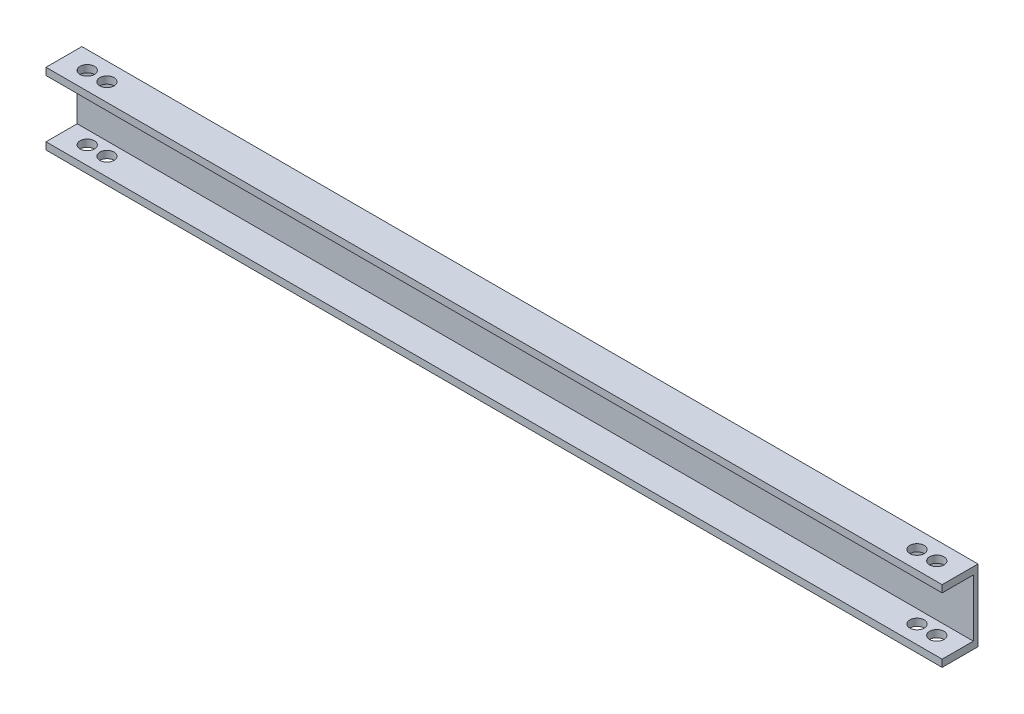
ISO-10303-21;
HEADER;
FILE_DESCRIPTION(('STEP AP214'),'2;1');
FILE_NAME('part.step','',(''),(''),'','','');
FILE_SCHEMA(('AUTOMOTIVE_DESIGN { 1 0 10303 214 1 1 1 1 }'));
ENDSEC;
DATA;
#1=APPLICATION_CONTEXT('core data for automotive mechanical design processes');
#2=APPLICATION_PROTOCOL_DEFINITION('international standard','automotive_design',2000,#1);
#3=PRODUCT_CONTEXT('',#1,'mechanical');
#4=PRODUCT('Part','Part','',(#3));
#5=PRODUCT_RELATED_PRODUCT_CATEGORY('part','',(#4));
#6=PRODUCT_DEFINITION_FORMATION('','',#4);
#7=PRODUCT_DEFINITION_CONTEXT('part definition',#1,'design');
#8=PRODUCT_DEFINITION('design','',#6,#7);
#9=PRODUCT_DEFINITION_SHAPE('','',#8);
#10=(LENGTH_UNIT() NAMED_UNIT(*) SI_UNIT(.MILLI.,.METRE.));
#11=(NAMED_UNIT(*) PLANE_ANGLE_UNIT() SI_UNIT($,.RADIAN.));
#12=(NAMED_UNIT(*) SI_UNIT($,.STERADIAN.) SOLID_ANGLE_UNIT());
#13=UNCERTAINTY_MEASURE_WITH_UNIT(LENGTH_MEASURE(1.E-05),#10,'distance_accuracy_value','');
#14=(GEOMETRIC_REPRESENTATION_CONTEXT(3) GLOBAL_UNCERTAINTY_ASSIGNED_CONTEXT((#13)) GLOBAL_UNIT_ASSIGNED_CONTEXT((#10,
#11,#12)) REPRESENTATION_CONTEXT('',''));
#15=CARTESIAN_POINT('',(0.,0.,0.));
#16=DIRECTION('',(0.,0.,1.));
#17=DIRECTION('',(1.,0.,0.));
#18=AXIS2_PLACEMENT_3D('',#15,#16,#17);
#19=CARTESIAN_POINT('',(-317.5,50.8,12.7));
#20=DIRECTION('',(0.,0.,-1.));
#21=DIRECTION('',(-1.,0.,0.));
#22=AXIS2_PLACEMENT_3D('',#19,#20,#21);
#23=PLANE('',#22);
#24=DIRECTION('',(0.,-1.,0.));
#25=VECTOR('',#24,1.);
#26=CARTESIAN_POINT('',(-317.5,50.8,12.7));
#27=LINE('',#26,#25);
#28=CARTESIAN_POINT('',(-317.5,50.8,12.7));
#29=VERTEX_POINT('',#28);
#30=CARTESIAN_POINT('',(-317.5,45.72,12.7));
#31=VERTEX_POINT('',#30);
#32=EDGE_CURVE('E187',#29,#31,#27,.T.);
#33=ORIENTED_EDGE('',*,*,#32,.T.);
#34=DIRECTION('',(-1.,0.,0.));
#35=VECTOR('',#34,1.);
#36=CARTESIAN_POINT('',(-317.5,45.72,12.7));
#37=LINE('',#36,#35);
#38=CARTESIAN_POINT('',(317.5,45.72,12.7));
#39=VERTEX_POINT('',#38);
#40=EDGE_CURVE('E124',#39,#31,#37,.T.);
#41=ORIENTED_EDGE('',*,*,#40,.F.);
#42=DIRECTION('',(0.,-1.,0.));
#43=VECTOR('',#42,1.);
#44=CARTESIAN_POINT('',(317.5,50.8,12.7));
#45=LINE('',#44,#43);
#46=CARTESIAN_POINT('',(317.5,50.8,12.7));
#47=VERTEX_POINT('',#46);
#48=EDGE_CURVE('E184',#47,#39,#45,.T.);
#49=ORIENTED_EDGE('',*,*,#48,.F.);
#50=DIRECTION('',(1.,0.,0.));
#51=VECTOR('',#50,1.);
#52=CARTESIAN_POINT('',(-317.5,50.8,12.7));
#53=LINE('',#52,#51);
#54=EDGE_CURVE('E58',#29,#47,#53,.T.);
#55=ORIENTED_EDGE('',*,*,#54,.F.);
#56=EDGE_LOOP('',(#33,#41,#49,#55));
#57=FACE_BOUND('',#56,.T.);
#58=ADVANCED_FACE('F32',(#57),#23,.F.);
#59=CARTESIAN_POINT('',(-300.99,-2.53999999999999,0.));
#60=DIRECTION('',(0.,1.,0.));
#61=DIRECTION('',(0.,0.,1.));
#62=AXIS2_PLACEMENT_3D('',#59,#60,#61);
#63=CYLINDRICAL_SURFACE('',#62,5.07999999999996);
#64=CARTESIAN_POINT('',(-300.99,45.72,0.));
#65=DIRECTION('',(0.,1.,0.));
#66=DIRECTION('',(0.,0.,1.));
#67=AXIS2_PLACEMENT_3D('',#64,#65,#66);
#68=CIRCLE('',#67,5.07999999999996);
#69=CARTESIAN_POINT('',(-300.99,45.72,5.07999999999996));
#70=VERTEX_POINT('',#69);
#71=EDGE_CURVE('E152',#70,#70,#68,.F.);
#72=ORIENTED_EDGE('',*,*,#71,.T.);
#73=EDGE_LOOP('',(#72));
#74=FACE_BOUND('',#73,.T.);
#75=CARTESIAN_POINT('',(-300.99,50.8,0.));
#76=DIRECTION('',(0.,1.,0.));
#77=DIRECTION('',(0.,0.,1.));
#78=AXIS2_PLACEMENT_3D('',#75,#76,#77);
#79=CIRCLE('',#78,5.07999999999996);
#80=CARTESIAN_POINT('',(-300.99,50.8,5.07999999999996));
#81=VERTEX_POINT('',#80);
#82=EDGE_CURVE('E165',#81,#81,#79,.T.);
#83=ORIENTED_EDGE('',*,*,#82,.T.);
#84=EDGE_LOOP('',(#83));
#85=FACE_BOUND('',#84,.T.);
#86=ADVANCED_FACE('F239',(#74,#85),#63,.F.);
#87=CARTESIAN_POINT('',(287.02,-2.53999999999999,0.));
#88=DIRECTION('',(0.,1.,0.));
#89=DIRECTION('',(0.,0.,1.));
#90=AXIS2_PLACEMENT_3D('',#87,#88,#89);
#91=CYLINDRICAL_SURFACE('',#90,5.07999999999996);
#92=CARTESIAN_POINT('',(287.02,45.72,0.));
#93=DIRECTION('',(0.,1.,0.));
#94=DIRECTION('',(0.,0.,1.));
#95=AXIS2_PLACEMENT_3D('',#92,#93,#94);
#96=CIRCLE('',#95,5.07999999999996);
#97=CARTESIAN_POINT('',(287.02,45.72,5.07999999999996));
#98=VERTEX_POINT('',#97);
#99=EDGE_CURVE('E149',#98,#98,#96,.F.);
#100=ORIENTED_EDGE('',*,*,#99,.T.);
#101=EDGE_LOOP('',(#100));
#102=FACE_BOUND('',#101,.T.);
#103=CARTESIAN_POINT('',(287.02,50.8,0.));
#104=DIRECTION('',(0.,1.,0.));
#105=DIRECTION('',(0.,0.,1.));
#106=AXIS2_PLACEMENT_3D('',#103,#104,#105);
#107=CIRCLE('',#106,5.07999999999996);
#108=CARTESIAN_POINT('',(287.02,50.8,5.07999999999996));
#109=VERTEX_POINT('',#108);
#110=EDGE_CURVE('E155',#109,#109,#107,.T.);
#111=ORIENTED_EDGE('',*,*,#110,.T.);
#112=EDGE_LOOP('',(#111));
#113=FACE_BOUND('',#112,.T.);
#114=ADVANCED_FACE('F243',(#102,#113),#91,.F.);
#115=CARTESIAN_POINT('',(300.99,-2.53999999999999,0.));
#116=DIRECTION('',(0.,1.,0.));
#117=DIRECTION('',(0.,0.,1.));
#118=AXIS2_PLACEMENT_3D('',#115,#116,#117);
#119=CYLINDRICAL_SURFACE('',#118,5.07999999999996);
#120=CARTESIAN_POINT('',(300.99,45.72,0.));
#121=DIRECTION('',(0.,1.,0.));
#122=DIRECTION('',(0.,0.,1.));
#123=AXIS2_PLACEMENT_3D('',#120,#121,#122);
#124=CIRCLE('',#123,5.07999999999996);
#125=CARTESIAN_POINT('',(300.99,45.72,5.07999999999996));
#126=VERTEX_POINT('',#125);
#127=EDGE_CURVE('E146',#126,#126,#124,.F.);
#128=ORIENTED_EDGE('',*,*,#127,.T.);
#129=EDGE_LOOP('',(#128));
#130=FACE_BOUND('',#129,.T.);
#131=CARTESIAN_POINT('',(300.99,50.8,0.));
#132=DIRECTION('',(0.,1.,0.));
#133=DIRECTION('',(0.,0.,1.));
#134=AXIS2_PLACEMENT_3D('',#131,#132,#133);
#135=CIRCLE('',#134,5.07999999999996);
#136=CARTESIAN_POINT('',(300.99,50.8,5.07999999999996));
#137=VERTEX_POINT('',#136);
#138=EDGE_CURVE('E160',#137,#137,#135,.T.);
#139=ORIENTED_EDGE('',*,*,#138,.T.);
#140=EDGE_LOOP('',(#139));
#141=FACE_BOUND('',#140,.T.);
#142=ADVANCED_FACE('F250',(#130,#141),#119,.F.);
#143=CARTESIAN_POINT('',(-287.02,-2.53999999999999,0.));
#144=DIRECTION('',(0.,1.,0.));
#145=DIRECTION('',(0.,0.,1.));
#146=AXIS2_PLACEMENT_3D('',#143,#144,#145);
#147=CYLINDRICAL_SURFACE('',#146,5.07999999999996);
#148=CARTESIAN_POINT('',(-287.02,45.72,0.));
#149=DIRECTION('',(0.,1.,0.));
#150=DIRECTION('',(0.,0.,1.));
#151=AXIS2_PLACEMENT_3D('',#148,#149,#150);
#152=CIRCLE('',#151,5.07999999999996);
#153=CARTESIAN_POINT('',(-287.02,45.72,5.07999999999996));
#154=VERTEX_POINT('',#153);
#155=EDGE_CURVE('E36',#154,#154,#152,.F.);
#156=ORIENTED_EDGE('',*,*,#155,.T.);
#157=EDGE_LOOP('',(#156));
#158=FACE_BOUND('',#157,.T.);
#159=CARTESIAN_POINT('',(-287.02,50.8,0.));
#160=DIRECTION('',(0.,1.,0.));
#161=DIRECTION('',(0.,0.,1.));
#162=AXIS2_PLACEMENT_3D('',#159,#160,#161);
#163=CIRCLE('',#162,5.07999999999996);
#164=CARTESIAN_POINT('',(-287.02,50.8,5.07999999999996));
#165=VERTEX_POINT('',#164);
#166=EDGE_CURVE('E156',#165,#165,#163,.T.);
#167=ORIENTED_EDGE('',*,*,#166,.T.);
#168=EDGE_LOOP('',(#167));
#169=FACE_BOUND('',#168,.T.);
#170=ADVANCED_FACE('F285',(#158,#169),#147,.F.);
#171=CARTESIAN_POINT('',(317.5,50.8,12.7));
#172=DIRECTION('',(-1.,0.,0.));
#173=DIRECTION('',(0.,0.,1.));
#174=AXIS2_PLACEMENT_3D('',#171,#172,#173);
#175=PLANE('',#174);
#176=ORIENTED_EDGE('',*,*,#48,.T.);
#177=DIRECTION('',(0.,0.,1.));
#178=VECTOR('',#177,1.);
#179=CARTESIAN_POINT('',(317.5,45.72,-9.398));
#180=LINE('',#179,#178);
#181=CARTESIAN_POINT('',(317.5,45.72,-9.398));
#182=VERTEX_POINT('',#181);
#183=EDGE_CURVE('E131',#182,#39,#180,.T.);
#184=ORIENTED_EDGE('',*,*,#183,.F.);
#185=DIRECTION('',(0.,1.,0.));
#186=VECTOR('',#185,1.);
#187=CARTESIAN_POINT('',(317.5,45.72,-9.398));
#188=LINE('',#187,#186);
#189=CARTESIAN_POINT('',(317.5,5.08,-9.398));
#190=VERTEX_POINT('',#189);
#191=EDGE_CURVE('E114',#190,#182,#188,.T.);
#192=ORIENTED_EDGE('',*,*,#191,.F.);
#193=DIRECTION('',(0.,0.,1.));
#194=VECTOR('',#193,1.);
#195=CARTESIAN_POINT('',(317.5,5.08,-9.398));
#196=LINE('',#195,#194);
#197=CARTESIAN_POINT('',(317.5,5.08,12.7));
#198=VERTEX_POINT('',#197);
#199=EDGE_CURVE('E111',#190,#198,#196,.T.);
#200=ORIENTED_EDGE('',*,*,#199,.T.);
#201=CARTESIAN_POINT('',(317.5,0.,12.7));
#202=VERTEX_POINT('',#201);
#203=EDGE_CURVE('E80',#198,#202,#45,.T.);
#204=ORIENTED_EDGE('',*,*,#203,.T.);
#205=DIRECTION('',(0.,0.,-1.));
#206=VECTOR('',#205,1.);
#207=CARTESIAN_POINT('',(317.5,0.,12.7));
#208=LINE('',#207,#206);
#209=CARTESIAN_POINT('',(317.5,0.,-12.7));
#210=VERTEX_POINT('',#209);
#211=EDGE_CURVE('E177',#202,#210,#208,.T.);
#212=ORIENTED_EDGE('',*,*,#211,.T.);
#213=DIRECTION('',(0.,-1.,0.));
#214=VECTOR('',#213,1.);
#215=CARTESIAN_POINT('',(317.5,50.8,-12.7));
#216=LINE('',#215,#214);
#217=CARTESIAN_POINT('',(317.5,50.8,-12.7));
#218=VERTEX_POINT('',#217);
#219=EDGE_CURVE('E11',#218,#210,#216,.T.);
#220=ORIENTED_EDGE('',*,*,#219,.F.);
#221=DIRECTION('',(0.,0.,-1.));
#222=VECTOR('',#221,1.);
#223=CARTESIAN_POINT('',(317.5,50.8,12.7));
#224=LINE('',#223,#222);
#225=EDGE_CURVE('E170',#47,#218,#224,.T.);
#226=ORIENTED_EDGE('',*,*,#225,.F.);
#227=EDGE_LOOP('',(#176,#184,#192,#200,#204,#212,#220,#226));
#228=FACE_BOUND('',#227,.T.);
#229=ADVANCED_FACE('F34',(#228),#175,.F.);
#230=CARTESIAN_POINT('',(-317.5,50.8,-12.7));
#231=DIRECTION('',(0.,0.,1.));
#232=DIRECTION('',(1.,0.,0.));
#233=AXIS2_PLACEMENT_3D('',#230,#231,#232);
#234=PLANE('',#233);
#235=DIRECTION('',(-1.,0.,0.));
#236=VECTOR('',#235,1.);
#237=CARTESIAN_POINT('',(-317.5,0.,-12.7));
#238=LINE('',#237,#236);
#239=CARTESIAN_POINT('',(-317.5,0.,-12.7));
#240=VERTEX_POINT('',#239);
#241=EDGE_CURVE('E179',#210,#240,#238,.T.);
#242=ORIENTED_EDGE('',*,*,#241,.T.);
#243=DIRECTION('',(0.,-1.,0.));
#244=VECTOR('',#243,1.);
#245=CARTESIAN_POINT('',(-317.5,50.8,-12.7));
#246=LINE('',#245,#244);
#247=CARTESIAN_POINT('',(-317.5,50.8,-12.7));
#248=VERTEX_POINT('',#247);
#249=EDGE_CURVE('E41',#248,#240,#246,.T.);
#250=ORIENTED_EDGE('',*,*,#249,.F.);
#251=DIRECTION('',(-1.,0.,0.));
#252=VECTOR('',#251,1.);
#253=CARTESIAN_POINT('',(-317.5,50.8,-12.7));
#254=LINE('',#253,#252);
#255=EDGE_CURVE('E87',#218,#248,#254,.T.);
#256=ORIENTED_EDGE('',*,*,#255,.F.);
#257=ORIENTED_EDGE('',*,*,#219,.T.);
#258=EDGE_LOOP('',(#242,#250,#256,#257));
#259=FACE_BOUND('',#258,.T.);
#260=ADVANCED_FACE('F221',(#259),#234,.F.);
#261=CARTESIAN_POINT('',(-317.5,50.8,12.7));
#262=DIRECTION('',(1.,0.,0.));
#263=DIRECTION('',(0.,0.,-1.));
#264=AXIS2_PLACEMENT_3D('',#261,#262,#263);
#265=PLANE('',#264);
#266=DIRECTION('',(0.,-1.,0.));
#267=VECTOR('',#266,1.);
#268=CARTESIAN_POINT('',(-317.5,45.72,-9.398));
#269=LINE('',#268,#267);
#270=CARTESIAN_POINT('',(-317.5,45.72,-9.398));
#271=VERTEX_POINT('',#270);
#272=CARTESIAN_POINT('',(-317.5,5.08,-9.398));
#273=VERTEX_POINT('',#272);
#274=EDGE_CURVE('E115',#271,#273,#269,.T.);
#275=ORIENTED_EDGE('',*,*,#274,.F.);
#276=DIRECTION('',(0.,0.,1.));
#277=VECTOR('',#276,1.);
#278=CARTESIAN_POINT('',(-317.5,45.72,-9.398));
#279=LINE('',#278,#277);
#280=EDGE_CURVE('E201',#271,#31,#279,.T.);
#281=ORIENTED_EDGE('',*,*,#280,.T.);
#282=ORIENTED_EDGE('',*,*,#32,.F.);
#283=DIRECTION('',(0.,0.,1.));
#284=VECTOR('',#283,1.);
#285=CARTESIAN_POINT('',(-317.5,50.8,12.7));
#286=LINE('',#285,#284);
#287=EDGE_CURVE('E174',#248,#29,#286,.T.);
#288=ORIENTED_EDGE('',*,*,#287,.F.);
#289=ORIENTED_EDGE('',*,*,#249,.T.);
#290=DIRECTION('',(0.,0.,1.));
#291=VECTOR('',#290,1.);
#292=CARTESIAN_POINT('',(-317.5,0.,12.7));
#293=LINE('',#292,#291);
#294=CARTESIAN_POINT('',(-317.5,0.,12.7));
#295=VERTEX_POINT('',#294);
#296=EDGE_CURVE('E181',#240,#295,#293,.T.);
#297=ORIENTED_EDGE('',*,*,#296,.T.);
#298=CARTESIAN_POINT('',(-317.5,5.08000000000002,12.7));
#299=VERTEX_POINT('',#298);
#300=EDGE_CURVE('E129',#299,#295,#27,.T.);
#301=ORIENTED_EDGE('',*,*,#300,.F.);
#302=DIRECTION('',(0.,0.,1.));
#303=VECTOR('',#302,1.);
#304=CARTESIAN_POINT('',(-317.5,5.08,-9.398));
#305=LINE('',#304,#303);
#306=EDGE_CURVE('E49',#273,#299,#305,.T.);
#307=ORIENTED_EDGE('',*,*,#306,.F.);
#308=EDGE_LOOP('',(#275,#281,#282,#288,#289,#297,#301,#307));
#309=FACE_BOUND('',#308,.T.);
#310=ADVANCED_FACE('F127',(#309),#265,.F.);
#311=ORIENTED_EDGE('',*,*,#203,.F.);
#312=DIRECTION('',(1.,0.,0.));
#313=VECTOR('',#312,1.);
#314=CARTESIAN_POINT('',(-317.5,5.08,12.7));
#315=LINE('',#314,#313);
#316=EDGE_CURVE('E208',#299,#198,#315,.T.);
#317=ORIENTED_EDGE('',*,*,#316,.F.);
#318=ORIENTED_EDGE('',*,*,#300,.T.);
#319=DIRECTION('',(1.,0.,0.));
#320=VECTOR('',#319,1.);
#321=CARTESIAN_POINT('',(-317.5,0.,12.7));
#322=LINE('',#321,#320);
#323=EDGE_CURVE('E172',#295,#202,#322,.T.);
#324=ORIENTED_EDGE('',*,*,#323,.T.);
#325=EDGE_LOOP('',(#311,#317,#318,#324));
#326=FACE_BOUND('',#325,.T.);
#327=ADVANCED_FACE('F227',(#326),#23,.F.);
#328=CARTESIAN_POINT('',(0.,50.8,0.));
#329=DIRECTION('',(0.,-1.,0.));
#330=DIRECTION('',(0.,0.,-1.));
#331=AXIS2_PLACEMENT_3D('',#328,#329,#330);
#332=PLANE('',#331);
#333=ORIENTED_EDGE('',*,*,#166,.F.);
#334=EDGE_LOOP('',(#333));
#335=FACE_BOUND('',#334,.T.);
#336=ORIENTED_EDGE('',*,*,#138,.F.);
#337=EDGE_LOOP('',(#336));
#338=FACE_BOUND('',#337,.T.);
#339=ORIENTED_EDGE('',*,*,#110,.F.);
#340=EDGE_LOOP('',(#339));
#341=FACE_BOUND('',#340,.T.);
#342=ORIENTED_EDGE('',*,*,#82,.F.);
#343=EDGE_LOOP('',(#342));
#344=FACE_BOUND('',#343,.T.);
#345=ORIENTED_EDGE('',*,*,#225,.T.);
#346=ORIENTED_EDGE('',*,*,#255,.T.);
#347=ORIENTED_EDGE('',*,*,#287,.T.);
#348=ORIENTED_EDGE('',*,*,#54,.T.);
#349=EDGE_LOOP('',(#345,#346,#347,#348));
#350=FACE_BOUND('',#349,.T.);
#351=ADVANCED_FACE('F220',(#335,#338,#341,#344,#350),#332,.F.);
#352=CARTESIAN_POINT('',(0.,0.,0.));
#353=DIRECTION('',(0.,-1.,0.));
#354=DIRECTION('',(0.,0.,-1.));
#355=AXIS2_PLACEMENT_3D('',#352,#353,#354);
#356=PLANE('',#355);
#357=CARTESIAN_POINT('',(-287.02,0.,0.));
#358=DIRECTION('',(0.,-1.,0.));
#359=DIRECTION('',(0.,0.,-1.));
#360=AXIS2_PLACEMENT_3D('',#357,#358,#359);
#361=CIRCLE('',#360,5.07999999999996);
#362=CARTESIAN_POINT('',(-287.02,0.,-5.07999999999996));
#363=VERTEX_POINT('',#362);
#364=EDGE_CURVE('E169',#363,#363,#361,.T.);
#365=ORIENTED_EDGE('',*,*,#364,.F.);
#366=EDGE_LOOP('',(#365));
#367=FACE_BOUND('',#366,.T.);
#368=CARTESIAN_POINT('',(300.99,0.,0.));
#369=DIRECTION('',(0.,-1.,0.));
#370=DIRECTION('',(0.,0.,-1.));
#371=AXIS2_PLACEMENT_3D('',#368,#369,#370);
#372=CIRCLE('',#371,5.07999999999996);
#373=CARTESIAN_POINT('',(300.99,0.,-5.07999999999996));
#374=VERTEX_POINT('',#373);
#375=EDGE_CURVE('E196',#374,#374,#372,.T.);
#376=ORIENTED_EDGE('',*,*,#375,.F.);
#377=EDGE_LOOP('',(#376));
#378=FACE_BOUND('',#377,.T.);
#379=CARTESIAN_POINT('',(287.02,0.,0.));
#380=DIRECTION('',(0.,-1.,0.));
#381=DIRECTION('',(0.,0.,-1.));
#382=AXIS2_PLACEMENT_3D('',#379,#380,#381);
#383=CIRCLE('',#382,5.07999999999996);
#384=CARTESIAN_POINT('',(287.02,0.,-5.07999999999996));
#385=VERTEX_POINT('',#384);
#386=EDGE_CURVE('E159',#385,#385,#383,.T.);
#387=ORIENTED_EDGE('',*,*,#386,.F.);
#388=EDGE_LOOP('',(#387));
#389=FACE_BOUND('',#388,.T.);
#390=CARTESIAN_POINT('',(-300.99,0.,0.));
#391=DIRECTION('',(0.,-1.,0.));
#392=DIRECTION('',(0.,0.,-1.));
#393=AXIS2_PLACEMENT_3D('',#390,#391,#392);
#394=CIRCLE('',#393,5.07999999999996);
#395=CARTESIAN_POINT('',(-300.99,0.,-5.07999999999996));
#396=VERTEX_POINT('',#395);
#397=EDGE_CURVE('E168',#396,#396,#394,.T.);
#398=ORIENTED_EDGE('',*,*,#397,.F.);
#399=EDGE_LOOP('',(#398));
#400=FACE_BOUND('',#399,.T.);
#401=ORIENTED_EDGE('',*,*,#211,.F.);
#402=ORIENTED_EDGE('',*,*,#323,.F.);
#403=ORIENTED_EDGE('',*,*,#296,.F.);
#404=ORIENTED_EDGE('',*,*,#241,.F.);
#405=EDGE_LOOP('',(#401,#402,#403,#404));
#406=FACE_BOUND('',#405,.T.);
#407=ADVANCED_FACE('F224',(#367,#378,#389,#400,#406),#356,.T.);
#408=CARTESIAN_POINT('',(-300.99,5.08,0.));
#409=DIRECTION('',(0.,-1.,0.));
#410=DIRECTION('',(0.,0.,-1.));
#411=AXIS2_PLACEMENT_3D('',#408,#409,#410);
#412=CIRCLE('',#411,5.07999999999996);
#413=CARTESIAN_POINT('',(-300.99,5.08,-5.07999999999996));
#414=VERTEX_POINT('',#413);
#415=EDGE_CURVE('E143',#414,#414,#412,.F.);
#416=ORIENTED_EDGE('',*,*,#415,.T.);
#417=EDGE_LOOP('',(#416));
#418=FACE_BOUND('',#417,.T.);
#419=ORIENTED_EDGE('',*,*,#397,.T.);
#420=EDGE_LOOP('',(#419));
#421=FACE_BOUND('',#420,.T.);
#422=ADVANCED_FACE('F246',(#418,#421),#63,.F.);
#423=CARTESIAN_POINT('',(287.02,5.08,0.));
#424=DIRECTION('',(0.,-1.,0.));
#425=DIRECTION('',(0.,0.,-1.));
#426=AXIS2_PLACEMENT_3D('',#423,#424,#425);
#427=CIRCLE('',#426,5.07999999999996);
#428=CARTESIAN_POINT('',(287.02,5.08,-5.07999999999996));
#429=VERTEX_POINT('',#428);
#430=EDGE_CURVE('E139',#429,#429,#427,.F.);
#431=ORIENTED_EDGE('',*,*,#430,.T.);
#432=EDGE_LOOP('',(#431));
#433=FACE_BOUND('',#432,.T.);
#434=ORIENTED_EDGE('',*,*,#386,.T.);
#435=EDGE_LOOP('',(#434));
#436=FACE_BOUND('',#435,.T.);
#437=ADVANCED_FACE('F253',(#433,#436),#91,.F.);
#438=CARTESIAN_POINT('',(300.99,5.08,0.));
#439=DIRECTION('',(0.,-1.,0.));
#440=DIRECTION('',(0.,0.,-1.));
#441=AXIS2_PLACEMENT_3D('',#438,#439,#440);
#442=CIRCLE('',#441,5.07999999999996);
#443=CARTESIAN_POINT('',(300.99,5.08,-5.07999999999996));
#444=VERTEX_POINT('',#443);
#445=EDGE_CURVE('E136',#444,#444,#442,.F.);
#446=ORIENTED_EDGE('',*,*,#445,.T.);
#447=EDGE_LOOP('',(#446));
#448=FACE_BOUND('',#447,.T.);
#449=ORIENTED_EDGE('',*,*,#375,.T.);
#450=EDGE_LOOP('',(#449));
#451=FACE_BOUND('',#450,.T.);
#452=ADVANCED_FACE('F261',(#448,#451),#119,.F.);
#453=CARTESIAN_POINT('',(-287.02,5.08,0.));
#454=DIRECTION('',(0.,-1.,0.));
#455=DIRECTION('',(0.,0.,-1.));
#456=AXIS2_PLACEMENT_3D('',#453,#454,#455);
#457=CIRCLE('',#456,5.07999999999996);
#458=CARTESIAN_POINT('',(-287.02,5.08,-5.07999999999996));
#459=VERTEX_POINT('',#458);
#460=EDGE_CURVE('E140',#459,#459,#457,.F.);
#461=ORIENTED_EDGE('',*,*,#460,.T.);
#462=EDGE_LOOP('',(#461));
#463=FACE_BOUND('',#462,.T.);
#464=ORIENTED_EDGE('',*,*,#364,.T.);
#465=EDGE_LOOP('',(#464));
#466=FACE_BOUND('',#465,.T.);
#467=ADVANCED_FACE('F277',(#463,#466),#147,.F.);
#468=CARTESIAN_POINT('',(-317.5,45.72,-9.398));
#469=DIRECTION('',(0.,1.,0.));
#470=DIRECTION('',(0.,0.,1.));
#471=AXIS2_PLACEMENT_3D('',#468,#469,#470);
#472=PLANE('',#471);
#473=ORIENTED_EDGE('',*,*,#99,.F.);
#474=EDGE_LOOP('',(#473));
#475=FACE_BOUND('',#474,.T.);
#476=ORIENTED_EDGE('',*,*,#155,.F.);
#477=EDGE_LOOP('',(#476));
#478=FACE_BOUND('',#477,.T.);
#479=ORIENTED_EDGE('',*,*,#40,.T.);
#480=ORIENTED_EDGE('',*,*,#280,.F.);
#481=DIRECTION('',(-1.,0.,0.));
#482=VECTOR('',#481,1.);
#483=CARTESIAN_POINT('',(-317.5,45.72,-9.398));
#484=LINE('',#483,#482);
#485=EDGE_CURVE('E121',#182,#271,#484,.T.);
#486=ORIENTED_EDGE('',*,*,#485,.F.);
#487=ORIENTED_EDGE('',*,*,#183,.T.);
#488=EDGE_LOOP('',(#479,#480,#486,#487));
#489=FACE_BOUND('',#488,.T.);
#490=ORIENTED_EDGE('',*,*,#127,.F.);
#491=EDGE_LOOP('',(#490));
#492=FACE_BOUND('',#491,.T.);
#493=ORIENTED_EDGE('',*,*,#71,.F.);
#494=EDGE_LOOP('',(#493));
#495=FACE_BOUND('',#494,.T.);
#496=ADVANCED_FACE('F212',(#475,#478,#489,#492,#495),#472,.F.);
#497=CARTESIAN_POINT('',(-317.5,5.08,-9.398));
#498=DIRECTION('',(0.,-1.,0.));
#499=DIRECTION('',(0.,0.,-1.));
#500=AXIS2_PLACEMENT_3D('',#497,#498,#499);
#501=PLANE('',#500);
#502=ORIENTED_EDGE('',*,*,#430,.F.);
#503=EDGE_LOOP('',(#502));
#504=FACE_BOUND('',#503,.T.);
#505=ORIENTED_EDGE('',*,*,#460,.F.);
#506=EDGE_LOOP('',(#505));
#507=FACE_BOUND('',#506,.T.);
#508=ORIENTED_EDGE('',*,*,#316,.T.);
#509=ORIENTED_EDGE('',*,*,#199,.F.);
#510=DIRECTION('',(1.,0.,0.));
#511=VECTOR('',#510,1.);
#512=CARTESIAN_POINT('',(-317.5,5.08,-9.398));
#513=LINE('',#512,#511);
#514=EDGE_CURVE('E107',#273,#190,#513,.T.);
#515=ORIENTED_EDGE('',*,*,#514,.F.);
#516=ORIENTED_EDGE('',*,*,#306,.T.);
#517=EDGE_LOOP('',(#508,#509,#515,#516));
#518=FACE_BOUND('',#517,.T.);
#519=ORIENTED_EDGE('',*,*,#445,.F.);
#520=EDGE_LOOP('',(#519));
#521=FACE_BOUND('',#520,.T.);
#522=ORIENTED_EDGE('',*,*,#415,.F.);
#523=EDGE_LOOP('',(#522));
#524=FACE_BOUND('',#523,.T.);
#525=ADVANCED_FACE('F109',(#504,#507,#518,#521,#524),#501,.F.);
#526=CARTESIAN_POINT('',(0.,0.,-9.398));
#527=DIRECTION('',(0.,0.,1.));
#528=DIRECTION('',(1.,0.,0.));
#529=AXIS2_PLACEMENT_3D('',#526,#527,#528);
#530=PLANE('',#529);
#531=ORIENTED_EDGE('',*,*,#274,.T.);
#532=ORIENTED_EDGE('',*,*,#514,.T.);
#533=ORIENTED_EDGE('',*,*,#191,.T.);
#534=ORIENTED_EDGE('',*,*,#485,.T.);
#535=EDGE_LOOP('',(#531,#532,#533,#534));
#536=FACE_BOUND('',#535,.T.);
#537=ADVANCED_FACE('F119',(#536),#530,.T.);
#538=CLOSED_SHELL('',(#58,#86,#114,#142,#170,#229,#260,#310,#327,#351,#407,#422,#437,#452,#467,
#496,#525,#537));
#539=MANIFOLD_SOLID_BREP('B2',#538);
#540=ADVANCED_BREP_SHAPE_REPRESENTATION('',(#18,#539),#14);
#541=SHAPE_DEFINITION_REPRESENTATION(#9,#540);
ENDSEC;
END-ISO-10303-21;
